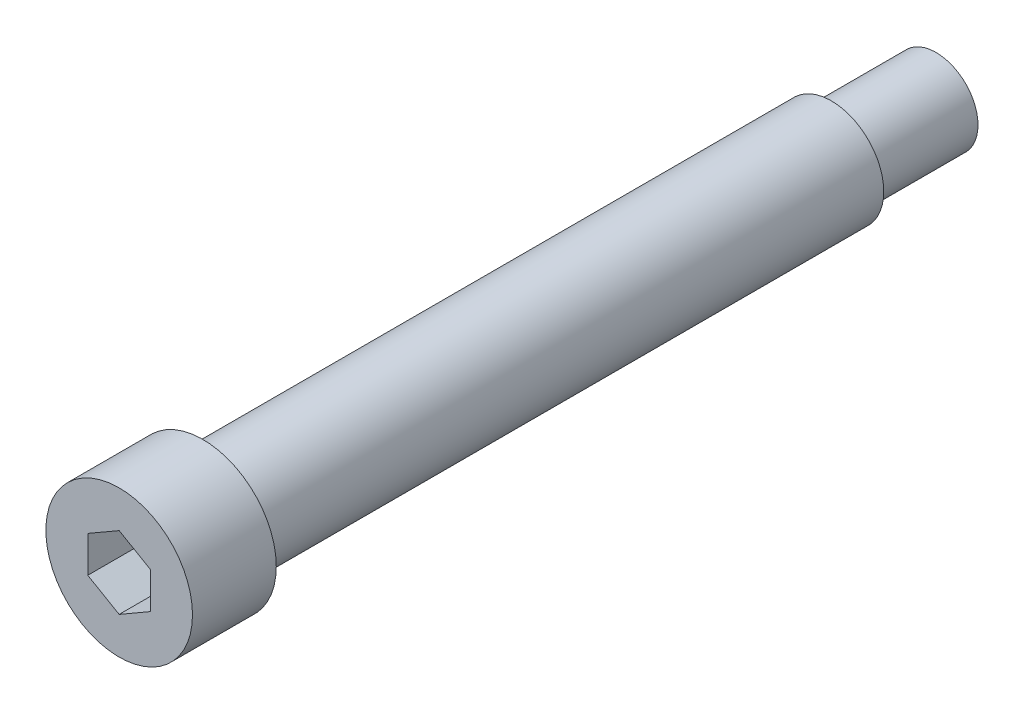
ISO-10303-21;
HEADER;
FILE_DESCRIPTION(('STEP AP214'),'2;1');
FILE_NAME('part.step','',(''),(''),'','','');
FILE_SCHEMA(('AUTOMOTIVE_DESIGN { 1 0 10303 214 1 1 1 1 }'));
ENDSEC;
DATA;
#1=APPLICATION_CONTEXT('core data for automotive mechanical design processes');
#2=APPLICATION_PROTOCOL_DEFINITION('international standard','automotive_design',2000,#1);
#3=PRODUCT_CONTEXT('',#1,'mechanical');
#4=PRODUCT('Part','Part','',(#3));
#5=PRODUCT_RELATED_PRODUCT_CATEGORY('part','',(#4));
#6=PRODUCT_DEFINITION_FORMATION('','',#4);
#7=PRODUCT_DEFINITION_CONTEXT('part definition',#1,'design');
#8=PRODUCT_DEFINITION('design','',#6,#7);
#9=PRODUCT_DEFINITION_SHAPE('','',#8);
#10=(LENGTH_UNIT() NAMED_UNIT(*) SI_UNIT(.MILLI.,.METRE.));
#11=(NAMED_UNIT(*) PLANE_ANGLE_UNIT() SI_UNIT($,.RADIAN.));
#12=(NAMED_UNIT(*) SI_UNIT($,.STERADIAN.) SOLID_ANGLE_UNIT());
#13=UNCERTAINTY_MEASURE_WITH_UNIT(LENGTH_MEASURE(1.E-05),#10,'distance_accuracy_value','');
#14=(GEOMETRIC_REPRESENTATION_CONTEXT(3) GLOBAL_UNCERTAINTY_ASSIGNED_CONTEXT((#13)) GLOBAL_UNIT_ASSIGNED_CONTEXT((#10,
#11,#12)) REPRESENTATION_CONTEXT('',''));
#15=CARTESIAN_POINT('',(0.,0.,0.));
#16=DIRECTION('',(0.,0.,1.));
#17=DIRECTION('',(1.,0.,0.));
#18=AXIS2_PLACEMENT_3D('',#15,#16,#17);
#19=CARTESIAN_POINT('',(0.,0.,5.));
#20=DIRECTION('',(0.,0.,-1.));
#21=DIRECTION('',(-1.,0.,0.));
#22=AXIS2_PLACEMENT_3D('',#19,#20,#21);
#23=CYLINDRICAL_SURFACE('',#22,2.);
#24=CARTESIAN_POINT('',(0.,0.,5.));
#25=DIRECTION('',(0.,0.,1.));
#26=DIRECTION('',(1.,0.,0.));
#27=AXIS2_PLACEMENT_3D('',#24,#25,#26);
#28=CIRCLE('',#27,2.);
#29=CARTESIAN_POINT('',(2.,0.,5.));
#30=VERTEX_POINT('',#29);
#31=EDGE_CURVE('E11',#30,#30,#28,.T.);
#32=ORIENTED_EDGE('',*,*,#31,.F.);
#33=EDGE_LOOP('',(#32));
#34=FACE_BOUND('',#33,.T.);
#35=CARTESIAN_POINT('',(0.,0.,0.));
#36=DIRECTION('',(0.,0.,1.));
#37=DIRECTION('',(1.,0.,0.));
#38=AXIS2_PLACEMENT_3D('',#35,#36,#37);
#39=CIRCLE('',#38,2.);
#40=CARTESIAN_POINT('',(2.,0.,0.));
#41=VERTEX_POINT('',#40);
#42=EDGE_CURVE('E38',#41,#41,#39,.T.);
#43=ORIENTED_EDGE('',*,*,#42,.T.);
#44=EDGE_LOOP('',(#43));
#45=FACE_BOUND('',#44,.T.);
#46=ADVANCED_FACE('F35',(#34,#45),#23,.T.);
#47=CARTESIAN_POINT('',(0.,0.,0.));
#48=DIRECTION('',(0.,0.,1.));
#49=DIRECTION('',(1.,0.,0.));
#50=AXIS2_PLACEMENT_3D('',#47,#48,#49);
#51=PLANE('',#50);
#52=ORIENTED_EDGE('',*,*,#42,.F.);
#53=EDGE_LOOP('',(#52));
#54=FACE_BOUND('',#53,.T.);
#55=ADVANCED_FACE('F168',(#54),#51,.F.);
#56=CARTESIAN_POINT('',(0.,0.,35.));
#57=DIRECTION('',(0.,0.,-1.));
#58=DIRECTION('',(-1.,0.,0.));
#59=AXIS2_PLACEMENT_3D('',#56,#57,#58);
#60=CYLINDRICAL_SURFACE('',#59,2.5);
#61=CARTESIAN_POINT('',(0.,0.,35.));
#62=DIRECTION('',(0.,0.,1.));
#63=DIRECTION('',(1.,0.,0.));
#64=AXIS2_PLACEMENT_3D('',#61,#62,#63);
#65=CIRCLE('',#64,2.5);
#66=CARTESIAN_POINT('',(2.5,0.,35.));
#67=VERTEX_POINT('',#66);
#68=EDGE_CURVE('E148',#67,#67,#65,.T.);
#69=ORIENTED_EDGE('',*,*,#68,.F.);
#70=EDGE_LOOP('',(#69));
#71=FACE_BOUND('',#70,.T.);
#72=CARTESIAN_POINT('',(0.,0.,5.));
#73=DIRECTION('',(0.,0.,1.));
#74=DIRECTION('',(1.,0.,0.));
#75=AXIS2_PLACEMENT_3D('',#72,#73,#74);
#76=CIRCLE('',#75,2.5);
#77=CARTESIAN_POINT('',(2.5,0.,5.));
#78=VERTEX_POINT('',#77);
#79=EDGE_CURVE('E145',#78,#78,#76,.T.);
#80=ORIENTED_EDGE('',*,*,#79,.T.);
#81=EDGE_LOOP('',(#80));
#82=FACE_BOUND('',#81,.T.);
#83=ADVANCED_FACE('F154',(#71,#82),#60,.T.);
#84=CARTESIAN_POINT('',(0.,0.,5.));
#85=DIRECTION('',(0.,0.,1.));
#86=DIRECTION('',(1.,0.,0.));
#87=AXIS2_PLACEMENT_3D('',#84,#85,#86);
#88=PLANE('',#87);
#89=ORIENTED_EDGE('',*,*,#31,.T.);
#90=EDGE_LOOP('',(#89));
#91=FACE_BOUND('',#90,.T.);
#92=ORIENTED_EDGE('',*,*,#79,.F.);
#93=EDGE_LOOP('',(#92));
#94=FACE_BOUND('',#93,.T.);
#95=ADVANCED_FACE('F156',(#91,#94),#88,.F.);
#96=CARTESIAN_POINT('',(0.,0.,39.));
#97=DIRECTION('',(0.,0.,-1.));
#98=DIRECTION('',(-1.,0.,0.));
#99=AXIS2_PLACEMENT_3D('',#96,#97,#98);
#100=CYLINDRICAL_SURFACE('',#99,3.5);
#101=CARTESIAN_POINT('',(0.,0.,39.));
#102=DIRECTION('',(0.,0.,1.));
#103=DIRECTION('',(1.,0.,0.));
#104=AXIS2_PLACEMENT_3D('',#101,#102,#103);
#105=CIRCLE('',#104,3.5);
#106=CARTESIAN_POINT('',(3.5,0.,39.));
#107=VERTEX_POINT('',#106);
#108=EDGE_CURVE('E142',#107,#107,#105,.T.);
#109=ORIENTED_EDGE('',*,*,#108,.F.);
#110=EDGE_LOOP('',(#109));
#111=FACE_BOUND('',#110,.T.);
#112=CARTESIAN_POINT('',(0.,0.,35.));
#113=DIRECTION('',(0.,0.,1.));
#114=DIRECTION('',(1.,0.,0.));
#115=AXIS2_PLACEMENT_3D('',#112,#113,#114);
#116=CIRCLE('',#115,3.5);
#117=CARTESIAN_POINT('',(3.5,0.,35.));
#118=VERTEX_POINT('',#117);
#119=EDGE_CURVE('E136',#118,#118,#116,.T.);
#120=ORIENTED_EDGE('',*,*,#119,.T.);
#121=EDGE_LOOP('',(#120));
#122=FACE_BOUND('',#121,.T.);
#123=ADVANCED_FACE('F158',(#111,#122),#100,.T.);
#124=CARTESIAN_POINT('',(0.,0.,39.));
#125=DIRECTION('',(0.,0.,1.));
#126=DIRECTION('',(1.,0.,0.));
#127=AXIS2_PLACEMENT_3D('',#124,#125,#126);
#128=PLANE('',#127);
#129=DIRECTION('',(0.,1.,0.));
#130=VECTOR('',#129,1.);
#131=CARTESIAN_POINT('',(1.5,-0.86602540378444,39.));
#132=LINE('',#131,#130);
#133=CARTESIAN_POINT('',(1.5,-0.86602540378444,39.));
#134=VERTEX_POINT('',#133);
#135=CARTESIAN_POINT('',(1.5,0.866025403784439,39.));
#136=VERTEX_POINT('',#135);
#137=EDGE_CURVE('E49',#134,#136,#132,.T.);
#138=ORIENTED_EDGE('',*,*,#137,.F.);
#139=DIRECTION('',(0.866025403784439,0.5,0.));
#140=VECTOR('',#139,1.);
#141=CARTESIAN_POINT('',(0.,-1.73205080756888,39.));
#142=LINE('',#141,#140);
#143=CARTESIAN_POINT('',(0.,-1.73205080756888,39.));
#144=VERTEX_POINT('',#143);
#145=EDGE_CURVE('E132',#144,#134,#142,.T.);
#146=ORIENTED_EDGE('',*,*,#145,.F.);
#147=DIRECTION('',(0.866025403784439,-0.5,0.));
#148=VECTOR('',#147,1.);
#149=CARTESIAN_POINT('',(-1.5,-0.866025403784439,39.));
#150=LINE('',#149,#148);
#151=CARTESIAN_POINT('',(-1.5,-0.866025403784439,39.));
#152=VERTEX_POINT('',#151);
#153=EDGE_CURVE('E130',#152,#144,#150,.T.);
#154=ORIENTED_EDGE('',*,*,#153,.F.);
#155=DIRECTION('',(0.,-1.,0.));
#156=VECTOR('',#155,1.);
#157=CARTESIAN_POINT('',(-1.5,0.86602540378444,39.));
#158=LINE('',#157,#156);
#159=CARTESIAN_POINT('',(-1.5,0.86602540378444,39.));
#160=VERTEX_POINT('',#159);
#161=EDGE_CURVE('E97',#160,#152,#158,.T.);
#162=ORIENTED_EDGE('',*,*,#161,.F.);
#163=DIRECTION('',(-0.866025403784439,-0.5,0.));
#164=VECTOR('',#163,1.);
#165=CARTESIAN_POINT('',(0.,1.73205080756888,39.));
#166=LINE('',#165,#164);
#167=CARTESIAN_POINT('',(0.,1.73205080756888,39.));
#168=VERTEX_POINT('',#167);
#169=EDGE_CURVE('E126',#168,#160,#166,.T.);
#170=ORIENTED_EDGE('',*,*,#169,.F.);
#171=DIRECTION('',(-0.866025403784439,0.5,0.));
#172=VECTOR('',#171,1.);
#173=CARTESIAN_POINT('',(1.5,0.866025403784439,39.));
#174=LINE('',#173,#172);
#175=EDGE_CURVE('E123',#136,#168,#174,.T.);
#176=ORIENTED_EDGE('',*,*,#175,.F.);
#177=EDGE_LOOP('',(#138,#146,#154,#162,#170,#176));
#178=FACE_BOUND('',#177,.T.);
#179=ORIENTED_EDGE('',*,*,#108,.T.);
#180=EDGE_LOOP('',(#179));
#181=FACE_BOUND('',#180,.T.);
#182=ADVANCED_FACE('F165',(#178,#181),#128,.T.);
#183=CARTESIAN_POINT('',(0.,0.,35.));
#184=DIRECTION('',(0.,0.,1.));
#185=DIRECTION('',(1.,0.,0.));
#186=AXIS2_PLACEMENT_3D('',#183,#184,#185);
#187=PLANE('',#186);
#188=ORIENTED_EDGE('',*,*,#68,.T.);
#189=EDGE_LOOP('',(#188));
#190=FACE_BOUND('',#189,.T.);
#191=ORIENTED_EDGE('',*,*,#119,.F.);
#192=EDGE_LOOP('',(#191));
#193=FACE_BOUND('',#192,.T.);
#194=ADVANCED_FACE('F204',(#190,#193),#187,.F.);
#195=CARTESIAN_POINT('',(1.5,-0.86602540378444,36.));
#196=DIRECTION('',(1.,0.,0.));
#197=DIRECTION('',(0.,0.,-1.));
#198=AXIS2_PLACEMENT_3D('',#195,#196,#197);
#199=PLANE('',#198);
#200=ORIENTED_EDGE('',*,*,#137,.T.);
#201=DIRECTION('',(0.,0.,1.));
#202=VECTOR('',#201,1.);
#203=CARTESIAN_POINT('',(1.5,0.866025403784439,36.));
#204=LINE('',#203,#202);
#205=CARTESIAN_POINT('',(1.5,0.866025403784439,36.));
#206=VERTEX_POINT('',#205);
#207=EDGE_CURVE('E79',#206,#136,#204,.T.);
#208=ORIENTED_EDGE('',*,*,#207,.F.);
#209=DIRECTION('',(0.,1.,0.));
#210=VECTOR('',#209,1.);
#211=CARTESIAN_POINT('',(1.5,-0.86602540378444,36.));
#212=LINE('',#211,#210);
#213=CARTESIAN_POINT('',(1.5,-0.86602540378444,36.));
#214=VERTEX_POINT('',#213);
#215=EDGE_CURVE('E134',#214,#206,#212,.T.);
#216=ORIENTED_EDGE('',*,*,#215,.F.);
#217=DIRECTION('',(0.,0.,1.));
#218=VECTOR('',#217,1.);
#219=CARTESIAN_POINT('',(1.5,-0.86602540378444,36.));
#220=LINE('',#219,#218);
#221=EDGE_CURVE('E57',#214,#134,#220,.T.);
#222=ORIENTED_EDGE('',*,*,#221,.T.);
#223=EDGE_LOOP('',(#200,#208,#216,#222));
#224=FACE_BOUND('',#223,.T.);
#225=ADVANCED_FACE('F209',(#224),#199,.F.);
#226=CARTESIAN_POINT('',(0.,-1.73205080756888,36.));
#227=DIRECTION('',(0.5,-0.866025403784439,0.));
#228=DIRECTION('',(0.866025403784439,0.5,0.));
#229=AXIS2_PLACEMENT_3D('',#226,#227,#228);
#230=PLANE('',#229);
#231=ORIENTED_EDGE('',*,*,#145,.T.);
#232=ORIENTED_EDGE('',*,*,#221,.F.);
#233=DIRECTION('',(0.866025403784439,0.5,0.));
#234=VECTOR('',#233,1.);
#235=CARTESIAN_POINT('',(0.,-1.73205080756888,36.));
#236=LINE('',#235,#234);
#237=CARTESIAN_POINT('',(0.,-1.73205080756888,36.));
#238=VERTEX_POINT('',#237);
#239=EDGE_CURVE('E109',#238,#214,#236,.T.);
#240=ORIENTED_EDGE('',*,*,#239,.F.);
#241=DIRECTION('',(0.,0.,1.));
#242=VECTOR('',#241,1.);
#243=CARTESIAN_POINT('',(0.,-1.73205080756888,36.));
#244=LINE('',#243,#242);
#245=EDGE_CURVE('E101',#238,#144,#244,.T.);
#246=ORIENTED_EDGE('',*,*,#245,.T.);
#247=EDGE_LOOP('',(#231,#232,#240,#246));
#248=FACE_BOUND('',#247,.T.);
#249=ADVANCED_FACE('F226',(#248),#230,.F.);
#250=CARTESIAN_POINT('',(-1.5,-0.866025403784439,36.));
#251=DIRECTION('',(-0.5,-0.866025403784439,0.));
#252=DIRECTION('',(0.866025403784439,-0.5,0.));
#253=AXIS2_PLACEMENT_3D('',#250,#251,#252);
#254=PLANE('',#253);
#255=ORIENTED_EDGE('',*,*,#153,.T.);
#256=ORIENTED_EDGE('',*,*,#245,.F.);
#257=DIRECTION('',(0.866025403784439,-0.5,0.));
#258=VECTOR('',#257,1.);
#259=CARTESIAN_POINT('',(-1.5,-0.866025403784439,36.));
#260=LINE('',#259,#258);
#261=CARTESIAN_POINT('',(-1.5,-0.866025403784439,36.));
#262=VERTEX_POINT('',#261);
#263=EDGE_CURVE('E105',#262,#238,#260,.T.);
#264=ORIENTED_EDGE('',*,*,#263,.F.);
#265=DIRECTION('',(0.,0.,1.));
#266=VECTOR('',#265,1.);
#267=CARTESIAN_POINT('',(-1.5,-0.866025403784439,36.));
#268=LINE('',#267,#266);
#269=EDGE_CURVE('E90',#262,#152,#268,.T.);
#270=ORIENTED_EDGE('',*,*,#269,.T.);
#271=EDGE_LOOP('',(#255,#256,#264,#270));
#272=FACE_BOUND('',#271,.T.);
#273=ADVANCED_FACE('F106',(#272),#254,.F.);
#274=CARTESIAN_POINT('',(-1.5,0.86602540378444,36.));
#275=DIRECTION('',(-1.,0.,0.));
#276=DIRECTION('',(0.,0.,1.));
#277=AXIS2_PLACEMENT_3D('',#274,#275,#276);
#278=PLANE('',#277);
#279=ORIENTED_EDGE('',*,*,#161,.T.);
#280=ORIENTED_EDGE('',*,*,#269,.F.);
#281=DIRECTION('',(0.,-1.,0.));
#282=VECTOR('',#281,1.);
#283=CARTESIAN_POINT('',(-1.5,0.86602540378444,36.));
#284=LINE('',#283,#282);
#285=CARTESIAN_POINT('',(-1.5,0.86602540378444,36.));
#286=VERTEX_POINT('',#285);
#287=EDGE_CURVE('E94',#286,#262,#284,.T.);
#288=ORIENTED_EDGE('',*,*,#287,.F.);
#289=DIRECTION('',(0.,0.,1.));
#290=VECTOR('',#289,1.);
#291=CARTESIAN_POINT('',(-1.5,0.86602540378444,36.));
#292=LINE('',#291,#290);
#293=EDGE_CURVE('E102',#286,#160,#292,.T.);
#294=ORIENTED_EDGE('',*,*,#293,.T.);
#295=EDGE_LOOP('',(#279,#280,#288,#294));
#296=FACE_BOUND('',#295,.T.);
#297=ADVANCED_FACE('F92',(#296),#278,.F.);
#298=CARTESIAN_POINT('',(0.,1.73205080756888,36.));
#299=DIRECTION('',(-0.5,0.866025403784439,0.));
#300=DIRECTION('',(-0.866025403784439,-0.5,0.));
#301=AXIS2_PLACEMENT_3D('',#298,#299,#300);
#302=PLANE('',#301);
#303=ORIENTED_EDGE('',*,*,#169,.T.);
#304=ORIENTED_EDGE('',*,*,#293,.F.);
#305=DIRECTION('',(-0.866025403784439,-0.5,0.));
#306=VECTOR('',#305,1.);
#307=CARTESIAN_POINT('',(0.,1.73205080756888,36.));
#308=LINE('',#307,#306);
#309=CARTESIAN_POINT('',(0.,1.73205080756888,36.));
#310=VERTEX_POINT('',#309);
#311=EDGE_CURVE('E115',#310,#286,#308,.T.);
#312=ORIENTED_EDGE('',*,*,#311,.F.);
#313=DIRECTION('',(0.,0.,1.));
#314=VECTOR('',#313,1.);
#315=CARTESIAN_POINT('',(0.,1.73205080756888,36.));
#316=LINE('',#315,#314);
#317=EDGE_CURVE('E139',#310,#168,#316,.T.);
#318=ORIENTED_EDGE('',*,*,#317,.T.);
#319=EDGE_LOOP('',(#303,#304,#312,#318));
#320=FACE_BOUND('',#319,.T.);
#321=ADVANCED_FACE('F251',(#320),#302,.F.);
#322=CARTESIAN_POINT('',(1.5,0.866025403784439,36.));
#323=DIRECTION('',(0.5,0.866025403784438,0.));
#324=DIRECTION('',(-0.866025403784439,0.5,0.));
#325=AXIS2_PLACEMENT_3D('',#322,#323,#324);
#326=PLANE('',#325);
#327=ORIENTED_EDGE('',*,*,#175,.T.);
#328=ORIENTED_EDGE('',*,*,#317,.F.);
#329=DIRECTION('',(-0.866025403784439,0.5,0.));
#330=VECTOR('',#329,1.);
#331=CARTESIAN_POINT('',(1.5,0.866025403784439,36.));
#332=LINE('',#331,#330);
#333=EDGE_CURVE('E117',#206,#310,#332,.T.);
#334=ORIENTED_EDGE('',*,*,#333,.F.);
#335=ORIENTED_EDGE('',*,*,#207,.T.);
#336=EDGE_LOOP('',(#327,#328,#334,#335));
#337=FACE_BOUND('',#336,.T.);
#338=ADVANCED_FACE('F260',(#337),#326,.F.);
#339=CARTESIAN_POINT('',(0.,0.,36.));
#340=DIRECTION('',(0.,0.,1.));
#341=DIRECTION('',(1.,0.,0.));
#342=AXIS2_PLACEMENT_3D('',#339,#340,#341);
#343=PLANE('',#342);
#344=ORIENTED_EDGE('',*,*,#215,.T.);
#345=ORIENTED_EDGE('',*,*,#333,.T.);
#346=ORIENTED_EDGE('',*,*,#311,.T.);
#347=ORIENTED_EDGE('',*,*,#287,.T.);
#348=ORIENTED_EDGE('',*,*,#263,.T.);
#349=ORIENTED_EDGE('',*,*,#239,.T.);
#350=EDGE_LOOP('',(#344,#345,#346,#347,#348,#349));
#351=FACE_BOUND('',#350,.T.);
#352=ADVANCED_FACE('F112',(#351),#343,.T.);
#353=CLOSED_SHELL('',(#46,#55,#83,#95,#123,#182,#194,#225,#249,#273,#297,#321,#338,#352));
#354=MANIFOLD_SOLID_BREP('B2',#353);
#355=ADVANCED_BREP_SHAPE_REPRESENTATION('',(#18,#354),#14);
#356=SHAPE_DEFINITION_REPRESENTATION(#9,#355);
ENDSEC;
END-ISO-10303-21;
